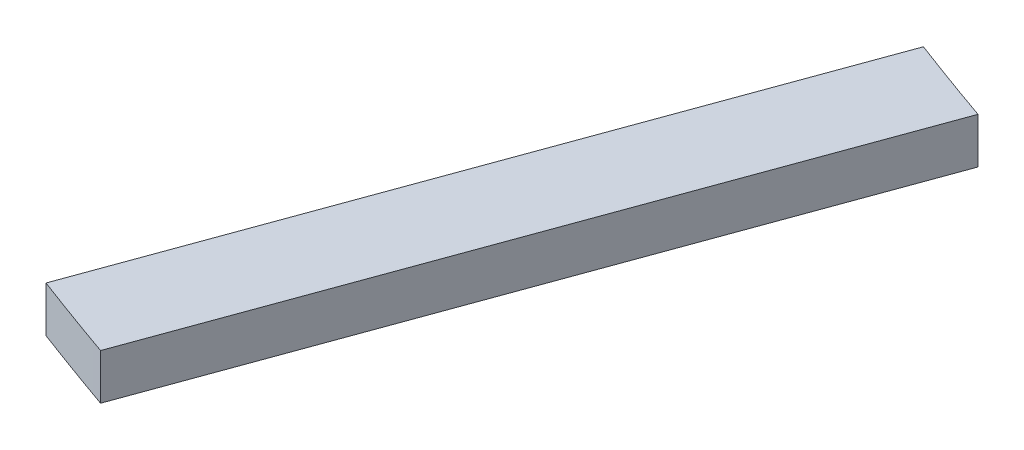
ISO-10303-21;
HEADER;
FILE_DESCRIPTION(('STEP AP214'),'2;1');
FILE_NAME('part.step','',(''),(''),'','','');
FILE_SCHEMA(('AUTOMOTIVE_DESIGN { 1 0 10303 214 1 1 1 1 }'));
ENDSEC;
DATA;
#1=APPLICATION_CONTEXT('core data for automotive mechanical design processes');
#2=APPLICATION_PROTOCOL_DEFINITION('international standard','automotive_design',2000,#1);
#3=PRODUCT_CONTEXT('',#1,'mechanical');
#4=PRODUCT('Part','Part','',(#3));
#5=PRODUCT_RELATED_PRODUCT_CATEGORY('part','',(#4));
#6=PRODUCT_DEFINITION_FORMATION('','',#4);
#7=PRODUCT_DEFINITION_CONTEXT('part definition',#1,'design');
#8=PRODUCT_DEFINITION('design','',#6,#7);
#9=PRODUCT_DEFINITION_SHAPE('','',#8);
#10=(LENGTH_UNIT() NAMED_UNIT(*) SI_UNIT(.MILLI.,.METRE.));
#11=(NAMED_UNIT(*) PLANE_ANGLE_UNIT() SI_UNIT($,.RADIAN.));
#12=(NAMED_UNIT(*) SI_UNIT($,.STERADIAN.) SOLID_ANGLE_UNIT());
#13=UNCERTAINTY_MEASURE_WITH_UNIT(LENGTH_MEASURE(1.E-05),#10,'distance_accuracy_value','');
#14=(GEOMETRIC_REPRESENTATION_CONTEXT(3) GLOBAL_UNCERTAINTY_ASSIGNED_CONTEXT((#13)) GLOBAL_UNIT_ASSIGNED_CONTEXT((#10,
#11,#12)) REPRESENTATION_CONTEXT('',''));
#15=CARTESIAN_POINT('',(0.,0.,0.));
#16=DIRECTION('',(0.,0.,1.));
#17=DIRECTION('',(1.,0.,0.));
#18=AXIS2_PLACEMENT_3D('',#15,#16,#17);
#19=CARTESIAN_POINT('',(0.,7.62,0.));
#20=DIRECTION('',(0.,1.,0.));
#21=DIRECTION('',(0.,0.,1.));
#22=AXIS2_PLACEMENT_3D('',#19,#20,#21);
#23=PLANE('',#22);
#24=DIRECTION('',(0.342020143325669,0.,-0.939692620785908));
#25=VECTOR('',#24,1.);
#26=CARTESIAN_POINT('',(-6.3934152541022,7.62,16.8231177262011));
#27=LINE('',#26,#25);
#28=CARTESIAN_POINT('',(-7.69661912027916,7.62,20.4036409214682));
#29=VERTEX_POINT('',#28);
#30=CARTESIAN_POINT('',(-6.3934152541022,7.62,16.8231177262011));
#31=VERTEX_POINT('',#30);
#32=EDGE_CURVE('E59',#29,#31,#27,.T.);
#33=ORIENTED_EDGE('',*,*,#32,.T.);
#34=CARTESIAN_POINT('',(0.,7.62,0.));
#35=DIRECTION('',(0.,1.,0.));
#36=DIRECTION('',(0.,0.,1.));
#37=AXIS2_PLACEMENT_3D('',#34,#35,#36);
#38=CIRCLE('',#37,17.9970288837077);
#39=CARTESIAN_POINT('',(-5.91605140274298,7.62,16.9968639590106));
#40=VERTEX_POINT('',#39);
#41=EDGE_CURVE('E81',#31,#40,#38,.T.);
#42=ORIENTED_EDGE('',*,*,#41,.T.);
#43=DIRECTION('',(-0.342020143325669,0.,0.939692620785908));
#44=VECTOR('',#43,1.);
#45=CARTESIAN_POINT('',(-5.91605140274296,7.62,16.9968639590105));
#46=LINE('',#45,#44);
#47=CARTESIAN_POINT('',(-7.21925526891994,7.62,20.5773871542777));
#48=VERTEX_POINT('',#47);
#49=EDGE_CURVE('E60',#40,#48,#46,.T.);
#50=ORIENTED_EDGE('',*,*,#49,.T.);
#51=CARTESIAN_POINT('',(0.,7.62,0.));
#52=DIRECTION('',(0.,1.,0.));
#53=DIRECTION('',(0.,0.,1.));
#54=AXIS2_PLACEMENT_3D('',#51,#52,#53);
#55=CIRCLE('',#54,21.8070288837077);
#56=EDGE_CURVE('E20',#29,#48,#55,.T.);
#57=ORIENTED_EDGE('',*,*,#56,.F.);
#58=EDGE_LOOP('',(#33,#42,#50,#57));
#59=FACE_BOUND('',#58,.T.);
#60=ADVANCED_FACE('F17',(#59),#23,.F.);
#61=CARTESIAN_POINT('',(0.,7.874,0.));
#62=DIRECTION('',(0.,1.,0.));
#63=DIRECTION('',(0.,0.,1.));
#64=AXIS2_PLACEMENT_3D('',#61,#62,#63);
#65=CYLINDRICAL_SURFACE('',#64,21.8070288837077);
#66=CARTESIAN_POINT('',(0.,7.874,0.));
#67=DIRECTION('',(0.,1.,0.));
#68=DIRECTION('',(0.,0.,1.));
#69=AXIS2_PLACEMENT_3D('',#66,#67,#68);
#70=CIRCLE('',#69,21.8070288837077);
#71=CARTESIAN_POINT('',(-7.69661912027917,7.874,20.4036409214682));
#72=VERTEX_POINT('',#71);
#73=CARTESIAN_POINT('',(-7.21925526891993,7.874,20.5773871542777));
#74=VERTEX_POINT('',#73);
#75=EDGE_CURVE('E68',#72,#74,#70,.T.);
#76=ORIENTED_EDGE('',*,*,#75,.F.);
#77=DIRECTION('',(0.,1.,0.));
#78=VECTOR('',#77,1.);
#79=CARTESIAN_POINT('',(-7.69661912027914,7.874,20.4036409214682));
#80=LINE('',#79,#78);
#81=EDGE_CURVE('E65',#72,#29,#80,.F.);
#82=ORIENTED_EDGE('',*,*,#81,.T.);
#83=ORIENTED_EDGE('',*,*,#56,.T.);
#84=DIRECTION('',(0.,1.,0.));
#85=VECTOR('',#84,1.);
#86=CARTESIAN_POINT('',(-7.21925526891993,7.874,20.5773871542777));
#87=LINE('',#86,#85);
#88=EDGE_CURVE('E63',#48,#74,#87,.T.);
#89=ORIENTED_EDGE('',*,*,#88,.T.);
#90=EDGE_LOOP('',(#76,#82,#83,#89));
#91=FACE_BOUND('',#90,.T.);
#92=ADVANCED_FACE('F66',(#91),#65,.T.);
#93=CARTESIAN_POINT('',(-5.91605140274296,7.874,16.9968639590105));
#94=DIRECTION('',(-0.939692620785908,0.,-0.342020143325669));
#95=DIRECTION('',(-0.342020143325669,0.,0.939692620785908));
#96=AXIS2_PLACEMENT_3D('',#93,#94,#95);
#97=PLANE('',#96);
#98=DIRECTION('',(0.,1.,0.));
#99=VECTOR('',#98,1.);
#100=CARTESIAN_POINT('',(-5.91605140274299,7.874,16.9968639590106));
#101=LINE('',#100,#99);
#102=CARTESIAN_POINT('',(-5.91605140274298,7.874,16.9968639590106));
#103=VERTEX_POINT('',#102);
#104=EDGE_CURVE('E79',#40,#103,#101,.T.);
#105=ORIENTED_EDGE('',*,*,#104,.T.);
#106=DIRECTION('',(0.342020143325665,0.,-0.93969262078591));
#107=VECTOR('',#106,1.);
#108=CARTESIAN_POINT('',(-7.21925526891992,7.874,20.5773871542777));
#109=LINE('',#108,#107);
#110=EDGE_CURVE('E73',#74,#103,#109,.T.);
#111=ORIENTED_EDGE('',*,*,#110,.F.);
#112=ORIENTED_EDGE('',*,*,#88,.F.);
#113=ORIENTED_EDGE('',*,*,#49,.F.);
#114=EDGE_LOOP('',(#105,#111,#112,#113));
#115=FACE_BOUND('',#114,.T.);
#116=ADVANCED_FACE('F90',(#115),#97,.F.);
#117=CARTESIAN_POINT('',(0.,7.874,0.));
#118=DIRECTION('',(0.,1.,0.));
#119=DIRECTION('',(0.,0.,1.));
#120=AXIS2_PLACEMENT_3D('',#117,#118,#119);
#121=CYLINDRICAL_SURFACE('',#120,17.9970288837077);
#122=DIRECTION('',(0.,1.,0.));
#123=VECTOR('',#122,1.);
#124=CARTESIAN_POINT('',(-6.3934152541022,7.874,16.8231177262011));
#125=LINE('',#124,#123);
#126=CARTESIAN_POINT('',(-6.39341525410221,7.874,16.8231177262011));
#127=VERTEX_POINT('',#126);
#128=EDGE_CURVE('E35',#31,#127,#125,.T.);
#129=ORIENTED_EDGE('',*,*,#128,.T.);
#130=CARTESIAN_POINT('',(0.,7.874,0.));
#131=DIRECTION('',(0.,1.,0.));
#132=DIRECTION('',(0.,0.,1.));
#133=AXIS2_PLACEMENT_3D('',#130,#131,#132);
#134=CIRCLE('',#133,17.9970288837077);
#135=EDGE_CURVE('E26',#103,#127,#134,.F.);
#136=ORIENTED_EDGE('',*,*,#135,.F.);
#137=ORIENTED_EDGE('',*,*,#104,.F.);
#138=ORIENTED_EDGE('',*,*,#41,.F.);
#139=EDGE_LOOP('',(#129,#136,#137,#138));
#140=FACE_BOUND('',#139,.T.);
#141=ADVANCED_FACE('F92',(#140),#121,.F.);
#142=CARTESIAN_POINT('',(-6.3934152541022,7.874,16.8231177262011));
#143=DIRECTION('',(0.939692620785908,0.,0.342020143325669));
#144=DIRECTION('',(0.342020143325669,0.,-0.939692620785908));
#145=AXIS2_PLACEMENT_3D('',#142,#143,#144);
#146=PLANE('',#145);
#147=ORIENTED_EDGE('',*,*,#81,.F.);
#148=DIRECTION('',(-0.342020143325674,0.,0.939692620785906));
#149=VECTOR('',#148,1.);
#150=CARTESIAN_POINT('',(-6.39341525410221,7.874,16.8231177262011));
#151=LINE('',#150,#149);
#152=EDGE_CURVE('E11',#127,#72,#151,.T.);
#153=ORIENTED_EDGE('',*,*,#152,.F.);
#154=ORIENTED_EDGE('',*,*,#128,.F.);
#155=ORIENTED_EDGE('',*,*,#32,.F.);
#156=EDGE_LOOP('',(#147,#153,#154,#155));
#157=FACE_BOUND('',#156,.T.);
#158=ADVANCED_FACE('F71',(#157),#146,.F.);
#159=CARTESIAN_POINT('',(0.,7.874,0.));
#160=DIRECTION('',(0.,1.,0.));
#161=DIRECTION('',(0.,0.,1.));
#162=AXIS2_PLACEMENT_3D('',#159,#160,#161);
#163=PLANE('',#162);
#164=ORIENTED_EDGE('',*,*,#135,.T.);
#165=ORIENTED_EDGE('',*,*,#152,.T.);
#166=ORIENTED_EDGE('',*,*,#75,.T.);
#167=ORIENTED_EDGE('',*,*,#110,.T.);
#168=EDGE_LOOP('',(#164,#165,#166,#167));
#169=FACE_BOUND('',#168,.T.);
#170=ADVANCED_FACE('F89',(#169),#163,.T.);
#171=CLOSED_SHELL('',(#60,#92,#116,#141,#158,#170));
#172=MANIFOLD_SOLID_BREP('B1',#171);
#173=ADVANCED_BREP_SHAPE_REPRESENTATION('',(#18,#172),#14);
#174=SHAPE_DEFINITION_REPRESENTATION(#9,#173);
ENDSEC;
END-ISO-10303-21;
